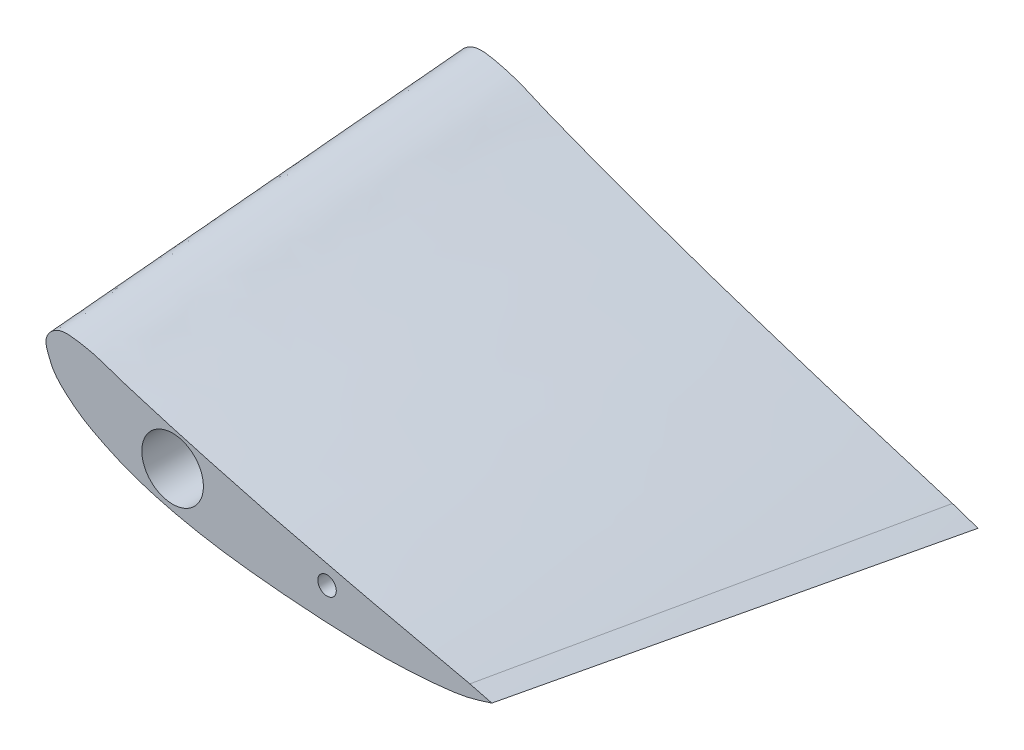
ISO-10303-21;
HEADER;
FILE_DESCRIPTION(('STEP AP214'),'2;1');
FILE_NAME('part.step','',(''),(''),'','','');
FILE_SCHEMA(('AUTOMOTIVE_DESIGN { 1 0 10303 214 1 1 1 1 }'));
ENDSEC;
DATA;
#1=APPLICATION_CONTEXT('core data for automotive mechanical design processes');
#2=APPLICATION_PROTOCOL_DEFINITION('international standard','automotive_design',2000,#1);
#3=PRODUCT_CONTEXT('',#1,'mechanical');
#4=PRODUCT('Part','Part','',(#3));
#5=PRODUCT_RELATED_PRODUCT_CATEGORY('part','',(#4));
#6=PRODUCT_DEFINITION_FORMATION('','',#4);
#7=PRODUCT_DEFINITION_CONTEXT('part definition',#1,'design');
#8=PRODUCT_DEFINITION('design','',#6,#7);
#9=PRODUCT_DEFINITION_SHAPE('','',#8);
#10=(LENGTH_UNIT() NAMED_UNIT(*) SI_UNIT(.MILLI.,.METRE.));
#11=(NAMED_UNIT(*) PLANE_ANGLE_UNIT() SI_UNIT($,.RADIAN.));
#12=(NAMED_UNIT(*) SI_UNIT($,.STERADIAN.) SOLID_ANGLE_UNIT());
#13=UNCERTAINTY_MEASURE_WITH_UNIT(LENGTH_MEASURE(1.E-05),#10,'distance_accuracy_value','');
#14=(GEOMETRIC_REPRESENTATION_CONTEXT(3) GLOBAL_UNCERTAINTY_ASSIGNED_CONTEXT((#13)) GLOBAL_UNIT_ASSIGNED_CONTEXT((#10,
#11,#12)) REPRESENTATION_CONTEXT('',''));
#15=CARTESIAN_POINT('',(0.,0.,0.));
#16=DIRECTION('',(0.,0.,1.));
#17=DIRECTION('',(1.,0.,0.));
#18=AXIS2_PLACEMENT_3D('',#15,#16,#17);
#19=CARTESIAN_POINT('',(-22.8791566427922,7.44781594855477,-70.));
#20=DIRECTION('',(0.,0.,1.));
#21=DIRECTION('',(1.,0.,0.));
#22=AXIS2_PLACEMENT_3D('',#19,#20,#21);
#23=PLANE('',#22);
#24=CARTESIAN_POINT('',(25.0709543311335,-3.88232454138966,-70.));
#25=DIRECTION('',(0.,0.,1.));
#26=DIRECTION('',(1.,0.,0.));
#27=AXIS2_PLACEMENT_3D('',#24,#25,#26);
#28=CIRCLE('',#27,1.5);
#29=CARTESIAN_POINT('',(26.5709543311335,-3.88232454138966,-70.));
#30=VERTEX_POINT('',#29);
#31=EDGE_CURVE('E86',#30,#30,#28,.T.);
#32=ORIENTED_EDGE('',*,*,#31,.T.);
#33=EDGE_LOOP('',(#32));
#34=FACE_BOUND('',#33,.T.);
#35=CARTESIAN_POINT('',(0.,0.,-70.));
#36=DIRECTION('',(0.,0.,1.));
#37=DIRECTION('',(1.,0.,0.));
#38=AXIS2_PLACEMENT_3D('',#35,#36,#37);
#39=CIRCLE('',#38,5.);
#40=CARTESIAN_POINT('',(5.,0.,-70.));
#41=VERTEX_POINT('',#40);
#42=EDGE_CURVE('E66',#41,#41,#39,.T.);
#43=ORIENTED_EDGE('',*,*,#42,.T.);
#44=EDGE_LOOP('',(#43));
#45=FACE_BOUND('',#44,.T.);
#46=CARTESIAN_POINT('',(56.6024570185074,-11.5896250219396,-70.));
#47=CARTESIAN_POINT('',(55.2048134510122,-11.1604344935175,-70.));
#48=CARTESIAN_POINT('',(51.0118827485278,-9.87286290825259,-70.));
#49=CARTESIAN_POINT('',(44.0279175606617,-7.71350006442647,-70.));
#50=CARTESIAN_POINT('',(35.6276858278107,-5.18691611165618,-70.));
#51=CARTESIAN_POINT('',(27.3032106553515,-2.42468744187908,-70.));
#52=CARTESIAN_POINT('',(18.9372859201274,0.206829889001657,-70.));
#53=CARTESIAN_POINT('',(10.6670025413464,3.12378232174524,-70.));
#54=CARTESIAN_POINT('',(2.39098564219053,6.02939924220704,-70.));
#55=CARTESIAN_POINT('',(-4.42699730849515,8.66798481093618,-70.));
#56=CARTESIAN_POINT('',(-9.89533665558932,10.7584765391876,-70.));
#57=CARTESIAN_POINT('',(-13.2101744749283,12.3192783347707,-70.));
#58=CARTESIAN_POINT('',(-16.0130505366379,13.2061990844741,-70.));
#59=CARTESIAN_POINT('',(-18.1637386075881,13.7060850713725,-70.));
#60=CARTESIAN_POINT('',(-20.1343217783409,14.0072685357314,-70.));
#61=CARTESIAN_POINT('',(-22.2016730413183,13.3851171873459,-70.));
#62=CARTESIAN_POINT('',(-24.0774533883304,11.4933873008038,-70.));
#63=CARTESIAN_POINT('',(-23.4002403885398,8.96157065658385,-70.));
#64=CARTESIAN_POINT('',(-22.6715373512482,6.71671597283292,-70.));
#65=CARTESIAN_POINT('',(-21.3153036700787,4.7741931180889,-70.));
#66=CARTESIAN_POINT('',(-19.527035772496,2.97484751217062,-70.));
#67=CARTESIAN_POINT('',(-17.2050988353966,0.864507080193705,-70.));
#68=CARTESIAN_POINT('',(-13.9827172985531,-1.16205904992076,-70.));
#69=CARTESIAN_POINT('',(-8.82190676397202,-4.07801028604748,-70.));
#70=CARTESIAN_POINT('',(-1.95448420856356,-6.75510285468226,-70.));
#71=CARTESIAN_POINT('',(6.50190655456598,-9.19809055034063,-70.));
#72=CARTESIAN_POINT('',(15.1615999891373,-10.9689467410081,-70.));
#73=CARTESIAN_POINT('',(23.9308718776157,-12.4137043340175,-70.));
#74=CARTESIAN_POINT('',(32.8085964211833,-13.5985279541091,-70.));
#75=CARTESIAN_POINT('',(41.8528484347002,-14.4120815557239,-70.));
#76=CARTESIAN_POINT('',(49.5277190812126,-14.461496170333,-70.));
#77=CARTESIAN_POINT('',(55.9026581379685,-14.1804427216733,-70.));
#78=CARTESIAN_POINT('',(59.0999556251021,-13.4036398299236,-70.));
#79=CARTESIAN_POINT('',(60.7529116850797,-13.0020440908682,-70.));
#80=B_SPLINE_CURVE_WITH_KNOTS('',3,(#46,#47,#48,#49,#50,#51,#52,#53,#54,#55,#56,#57,#58,#59,#60,
#61,#62,#63,#64,#65,#66,#67,#68,#69,#70,#71,#72,#73,#74,#75,#76,#77,#78,#79),.UNSPECIFIED.,.F.,
.F.,(4,1,1,1,1,1,1,1,1,1,1,1,1,1,1,1,1,1,1,1,1,1,1,1,1,1,1,1,1,1,1,4),(0.,0.024539223239315,
0.0736176697179449,0.122696116196575,0.171758102468826,0.220820088741077,0.269879113320182,
0.318936693489756,0.368025361597795,0.392583028094628,0.417173001250673,0.429440472758663,
0.441764658743505,0.454461371263475,0.461994015532278,0.477712656864197,0.492780517083889,
0.502278122505289,0.517831839222446,0.531656069899839,0.544957030128068,0.57036121074101,
0.595284183630096,0.644429948946362,0.693535769444944,0.742943262592495,0.792666042354747,
0.842690657547491,0.893260265870848,0.94491578158227,0.971522264346957,1.),.UNSPECIFIED.);
#81=CARTESIAN_POINT('',(56.6024570185074,-11.5896250219396,-70.));
#82=VERTEX_POINT('',#81);
#83=CARTESIAN_POINT('',(60.7529116850797,-13.0020440908682,-70.));
#84=VERTEX_POINT('',#83);
#85=EDGE_CURVE('E63',#82,#84,#80,.T.);
#86=ORIENTED_EDGE('',*,*,#85,.F.);
#87=DIRECTION('',(-0.946684808707422,0.322161253043554,0.));
#88=VECTOR('',#87,1.);
#89=CARTESIAN_POINT('',(56.6024570185074,-11.5896250219396,-70.));
#90=LINE('',#89,#88);
#91=EDGE_CURVE('E37',#84,#82,#90,.T.);
#92=ORIENTED_EDGE('',*,*,#91,.F.);
#93=EDGE_LOOP('',(#86,#92));
#94=FACE_BOUND('',#93,.T.);
#95=ADVANCED_FACE('F34',(#34,#45,#94),#23,.F.);
#96=CARTESIAN_POINT('',(-19.6811363137598,4.79492425979761,0.));
#97=DIRECTION('',(0.,0.,1.));
#98=DIRECTION('',(1.,0.,0.));
#99=AXIS2_PLACEMENT_3D('',#96,#97,#98);
#100=PLANE('',#99);
#101=CARTESIAN_POINT('',(25.0709543311335,-3.88232454138966,0.));
#102=DIRECTION('',(0.,0.,1.));
#103=DIRECTION('',(1.,0.,0.));
#104=AXIS2_PLACEMENT_3D('',#101,#102,#103);
#105=CIRCLE('',#104,1.5);
#106=CARTESIAN_POINT('',(26.5709543311335,-3.88232454138966,0.));
#107=VERTEX_POINT('',#106);
#108=EDGE_CURVE('E89',#107,#107,#105,.T.);
#109=ORIENTED_EDGE('',*,*,#108,.F.);
#110=EDGE_LOOP('',(#109));
#111=FACE_BOUND('',#110,.T.);
#112=CARTESIAN_POINT('',(0.,0.,0.));
#113=DIRECTION('',(0.,0.,1.));
#114=DIRECTION('',(1.,0.,0.));
#115=AXIS2_PLACEMENT_3D('',#112,#113,#114);
#116=CIRCLE('',#115,5.);
#117=CARTESIAN_POINT('',(5.,0.,0.));
#118=VERTEX_POINT('',#117);
#119=EDGE_CURVE('E80',#118,#118,#116,.T.);
#120=ORIENTED_EDGE('',*,*,#119,.F.);
#121=EDGE_LOOP('',(#120));
#122=FACE_BOUND('',#121,.T.);
#123=CARTESIAN_POINT('',(48.2551757332759,-6.12373169062847,0.));
#124=CARTESIAN_POINT('',(47.054535391202,-5.85246277333931,0.));
#125=CARTESIAN_POINT('',(43.4526143649815,-5.03865602147288,0.));
#126=CARTESIAN_POINT('',(37.4521284584218,-3.67078287712665,0.));
#127=CARTESIAN_POINT('',(30.2393159603486,-2.0848495014263,0.));
#128=CARTESIAN_POINT('',(23.0750893565596,-0.296270211024556,0.));
#129=CARTESIAN_POINT('',(15.8843927973687,1.37993852480165,0.));
#130=CARTESIAN_POINT('',(8.75580346600157,3.30185812214174,0.));
#131=CARTESIAN_POINT('',(1.62312300397187,5.21389650059937,0.));
#132=CARTESIAN_POINT('',(-4.26854985932617,6.99464303809463,0.));
#133=CARTESIAN_POINT('',(-8.99230347266472,8.40124550387566,0.));
#134=CARTESIAN_POINT('',(-11.8744834802206,9.50035957220869,0.));
#135=CARTESIAN_POINT('',(-14.2839529373644,10.0663726357262,0.));
#136=CARTESIAN_POINT('',(-16.1212661725206,10.3490202847083,0.));
#137=CARTESIAN_POINT('',(-17.7947266612632,10.4763328510267,0.));
#138=CARTESIAN_POINT('',(-19.4906059492009,9.82235552950465,0.));
#139=CARTESIAN_POINT('',(-20.9447919807827,8.11478913625125,0.));
#140=CARTESIAN_POINT('',(-20.2150047137434,6.03250555271122,0.));
#141=CARTESIAN_POINT('',(-19.4602718509725,4.19440216003422,0.));
#142=CARTESIAN_POINT('',(-18.1979949940236,2.65007560494015,0.));
#143=CARTESIAN_POINT('',(-16.582152295265,1.25346484961709,0.));
#144=CARTESIAN_POINT('',(-14.4984920142379,-0.370226607055651,0.));
#145=CARTESIAN_POINT('',(-11.6642584136947,-1.86623233714782,0.));
#146=CARTESIAN_POINT('',(-7.14608873902189,-3.98538532749056,0.));
#147=CARTESIAN_POINT('',(-1.21045916642468,-5.79530860449215,0.));
#148=CARTESIAN_POINT('',(6.04417290243166,-7.30748683583701,0.));
#149=CARTESIAN_POINT('',(13.4266596421643,-8.24247032524399,0.));
#150=CARTESIAN_POINT('',(20.8803633235686,-8.89671876227693,0.));
#151=CARTESIAN_POINT('',(28.4085535518336,-9.32584807197122,0.));
#152=CARTESIAN_POINT('',(36.0528911415558,-9.43269393728231,0.));
#153=CARTESIAN_POINT('',(42.4989778165968,-8.98528636466733,0.));
#154=CARTESIAN_POINT('',(47.832740527097,-8.34326163812348,0.));
#155=CARTESIAN_POINT('',(50.4673414200419,-7.48747891974686,0.));
#156=CARTESIAN_POINT('',(51.8293915668112,-7.04505176492108,0.));
#157=B_SPLINE_CURVE_WITH_KNOTS('',3,(#123,#124,#125,#126,#127,#128,#129,#130,#131,#132,#133,
#134,#135,#136,#137,#138,#139,#140,#141,#142,#143,#144,#145,#146,#147,#148,#149,#150,#151,#152,
#153,#154,#155,#156),.UNSPECIFIED.,.F.,.F.,(4,1,1,1,1,1,1,1,1,1,1,1,1,1,1,1,1,1,1,1,1,1,1,1,1,1,
1,1,1,1,1,4),(0.,0.024539223239315,0.0736176697179449,0.122696116196575,0.171758102468826,
0.220820088741077,0.269879113320182,0.318936693489756,0.368025361597795,0.392583028094628,
0.417173001250673,0.429440472758663,0.441764658743505,0.454461371263475,0.461994015532278,
0.477712656864197,0.492780517083889,0.502278122505289,0.517831839222446,0.531656069899839,
0.544957030128068,0.57036121074101,0.595284183630096,0.644429948946362,0.693535769444944,
0.742943262592495,0.792666042354747,0.842690657547491,0.893260265870848,0.94491578158227,
0.971522264346957,1.),.UNSPECIFIED.);
#158=CARTESIAN_POINT('',(48.2551757332759,-6.12373169062847,0.));
#159=VERTEX_POINT('',#158);
#160=CARTESIAN_POINT('',(51.8293915668112,-7.04505176492108,0.));
#161=VERTEX_POINT('',#160);
#162=EDGE_CURVE('E43',#159,#161,#157,.T.);
#163=ORIENTED_EDGE('',*,*,#162,.T.);
#164=DIRECTION('',(-0.968346652590715,0.249609215407518,0.));
#165=VECTOR('',#164,1.);
#166=CARTESIAN_POINT('',(48.2551757332759,-6.12373169062847,0.));
#167=LINE('',#166,#165);
#168=EDGE_CURVE('E11',#161,#159,#167,.T.);
#169=ORIENTED_EDGE('',*,*,#168,.T.);
#170=EDGE_LOOP('',(#163,#169));
#171=FACE_BOUND('',#170,.T.);
#172=ADVANCED_FACE('F104',(#111,#122,#171),#100,.T.);
#173=CARTESIAN_POINT('',(51.8293915668112,-7.04505176492108,0.));
#174=CARTESIAN_POINT('',(60.7529116850797,-13.0020440908682,-70.));
#175=CARTESIAN_POINT('',(50.4673414200419,-7.48747891974686,0.));
#176=CARTESIAN_POINT('',(59.0999556251021,-13.4036398299236,-70.));
#177=CARTESIAN_POINT('',(47.832740527097,-8.34326163812348,0.));
#178=CARTESIAN_POINT('',(55.9026581379685,-14.1804427216733,-70.));
#179=CARTESIAN_POINT('',(42.4989778165968,-8.98528636466733,0.));
#180=CARTESIAN_POINT('',(49.5277190812126,-14.461496170333,-70.));
#181=CARTESIAN_POINT('',(36.0528911415558,-9.43269393728231,0.));
#182=CARTESIAN_POINT('',(41.8528484347002,-14.4120815557239,-70.));
#183=CARTESIAN_POINT('',(28.4085535518336,-9.32584807197122,0.));
#184=CARTESIAN_POINT('',(32.8085964211833,-13.5985279541091,-70.));
#185=CARTESIAN_POINT('',(20.8803633235686,-8.89671876227693,0.));
#186=CARTESIAN_POINT('',(23.9308718776157,-12.4137043340175,-70.));
#187=CARTESIAN_POINT('',(13.4266596421643,-8.24247032524399,0.));
#188=CARTESIAN_POINT('',(15.1615999891373,-10.9689467410081,-70.));
#189=CARTESIAN_POINT('',(6.04417290243166,-7.30748683583701,0.));
#190=CARTESIAN_POINT('',(6.50190655456598,-9.19809055034063,-70.));
#191=CARTESIAN_POINT('',(-1.21045916642468,-5.79530860449215,0.));
#192=CARTESIAN_POINT('',(-1.95448420856356,-6.75510285468226,-70.));
#193=CARTESIAN_POINT('',(-7.14608873902189,-3.98538532749056,0.));
#194=CARTESIAN_POINT('',(-8.82190676397202,-4.07801028604748,-70.));
#195=CARTESIAN_POINT('',(-11.6642584136947,-1.86623233714782,0.));
#196=CARTESIAN_POINT('',(-13.9827172985531,-1.16205904992076,-70.));
#197=CARTESIAN_POINT('',(-14.4984920142379,-0.370226607055651,0.));
#198=CARTESIAN_POINT('',(-17.2050988353966,0.864507080193705,-70.));
#199=CARTESIAN_POINT('',(-16.582152295265,1.25346484961709,0.));
#200=CARTESIAN_POINT('',(-19.527035772496,2.97484751217062,-70.));
#201=CARTESIAN_POINT('',(-18.1979949940236,2.65007560494015,0.));
#202=CARTESIAN_POINT('',(-21.3153036700787,4.7741931180889,-70.));
#203=CARTESIAN_POINT('',(-19.4602718509725,4.19440216003422,0.));
#204=CARTESIAN_POINT('',(-22.6715373512482,6.71671597283292,-70.));
#205=CARTESIAN_POINT('',(-20.2150047137434,6.03250555271122,0.));
#206=CARTESIAN_POINT('',(-23.4002403885398,8.96157065658385,-70.));
#207=CARTESIAN_POINT('',(-20.9447919807827,8.11478913625125,0.));
#208=CARTESIAN_POINT('',(-24.0774533883304,11.4933873008038,-70.));
#209=CARTESIAN_POINT('',(-19.4906059492009,9.82235552950465,0.));
#210=CARTESIAN_POINT('',(-22.2016730413183,13.3851171873459,-70.));
#211=CARTESIAN_POINT('',(-17.7947266612632,10.4763328510267,0.));
#212=CARTESIAN_POINT('',(-20.1343217783409,14.0072685357314,-70.));
#213=CARTESIAN_POINT('',(-16.1212661725206,10.3490202847083,0.));
#214=CARTESIAN_POINT('',(-18.1637386075881,13.7060850713725,-70.));
#215=CARTESIAN_POINT('',(-14.2839529373644,10.0663726357262,0.));
#216=CARTESIAN_POINT('',(-16.0130505366379,13.2061990844741,-70.));
#217=CARTESIAN_POINT('',(-11.8744834802206,9.50035957220869,0.));
#218=CARTESIAN_POINT('',(-13.2101744749283,12.3192783347707,-70.));
#219=CARTESIAN_POINT('',(-8.99230347266472,8.40124550387566,0.));
#220=CARTESIAN_POINT('',(-9.89533665558932,10.7584765391876,-70.));
#221=CARTESIAN_POINT('',(-4.26854985932617,6.99464303809463,0.));
#222=CARTESIAN_POINT('',(-4.42699730849515,8.66798481093618,-70.));
#223=CARTESIAN_POINT('',(1.62312300397187,5.21389650059937,0.));
#224=CARTESIAN_POINT('',(2.39098564219053,6.02939924220704,-70.));
#225=CARTESIAN_POINT('',(8.75580346600157,3.30185812214174,0.));
#226=CARTESIAN_POINT('',(10.6670025413464,3.12378232174524,-70.));
#227=CARTESIAN_POINT('',(15.8843927973687,1.37993852480165,0.));
#228=CARTESIAN_POINT('',(18.9372859201274,0.206829889001657,-70.));
#229=CARTESIAN_POINT('',(23.0750893565596,-0.296270211024556,0.));
#230=CARTESIAN_POINT('',(27.3032106553515,-2.42468744187908,-70.));
#231=CARTESIAN_POINT('',(30.2393159603486,-2.0848495014263,0.));
#232=CARTESIAN_POINT('',(35.6276858278107,-5.18691611165618,-70.));
#233=CARTESIAN_POINT('',(37.4521284584218,-3.67078287712665,0.));
#234=CARTESIAN_POINT('',(44.0279175606617,-7.71350006442647,-70.));
#235=CARTESIAN_POINT('',(43.4526143649815,-5.03865602147288,0.));
#236=CARTESIAN_POINT('',(51.0118827485278,-9.87286290825259,-70.));
#237=CARTESIAN_POINT('',(47.054535391202,-5.85246277333931,0.));
#238=CARTESIAN_POINT('',(55.2048134510122,-11.1604344935175,-70.));
#239=CARTESIAN_POINT('',(48.2551757332759,-6.12373169062847,0.));
#240=CARTESIAN_POINT('',(56.6024570185074,-11.5896250219396,-70.));
#241=B_SPLINE_SURFACE_WITH_KNOTS('',3,1,((#173,#174),(#175,#176),(#177,#178),(#179,#180),(#181,
#182),(#183,#184),(#185,#186),(#187,#188),(#189,#190),(#191,#192),(#193,#194),(#195,#196),(#197,
#198),(#199,#200),(#201,#202),(#203,#204),(#205,#206),(#207,#208),(#209,#210),(#211,#212),(#213,
#214),(#215,#216),(#217,#218),(#219,#220),(#221,#222),(#223,#224),(#225,#226),(#227,#228),(#229,
#230),(#231,#232),(#233,#234),(#235,#236),(#237,#238),(#239,#240)),.UNSPECIFIED.,.F.,.F.,.F.,(4,
1,1,1,1,1,1,1,1,1,1,1,1,1,1,1,1,1,1,1,1,1,1,1,1,1,1,1,1,1,1,4),(2,2),(0.,0.0284777356530428,
0.05508421841773,0.106739734129152,0.157309342452509,0.207333957645253,0.257056737407505,
0.306464230555056,0.355570051053638,0.404715816369904,0.42963878925899,0.455042969871932,
0.468343930100161,0.482168160777554,0.497721877494711,0.507219482916111,0.522287343135803,
0.538005984467722,0.545538628736525,0.558235341256495,0.570559527241337,0.582826998749327,
0.607416971905372,0.631974638402205,0.681063306510244,0.730120886679818,0.779179911258923,
0.828241897531174,0.877303883803425,0.926382330282055,0.975460776760685,1.),(0.,1.),.UNSPECIFIED.);
#242=DIRECTION('',(0.11805366002295,-0.0773028595787185,-0.989993737988346));
#243=VECTOR('',#242,1.);
#244=CARTESIAN_POINT('',(52.4288163758916,-8.85667835628405,-35.));
#245=LINE('',#244,#243);
#246=EDGE_CURVE('E58',#159,#82,#245,.T.);
#247=DIRECTION('',(-0.126007315810468,0.0841175459177206,0.988456572051105));
#248=VECTOR('',#247,1.);
#249=CARTESIAN_POINT('',(56.2911516259454,-10.0235479278946,-35.));
#250=LINE('',#249,#248);
#251=EDGE_CURVE('E52',#84,#161,#250,.T.);
#252=ORIENTED_EDGE('',*,*,#162,.F.);
#253=ORIENTED_EDGE('',*,*,#246,.T.);
#254=ORIENTED_EDGE('',*,*,#85,.T.);
#255=ORIENTED_EDGE('',*,*,#251,.T.);
#256=EDGE_LOOP('',(#252,#253,#254,#255));
#257=FACE_BOUND('',#256,.T.);
#258=ADVANCED_FACE('F65',(#257),#241,.T.);
#259=CARTESIAN_POINT('',(48.2551757332759,-6.12373169062847,0.));
#260=CARTESIAN_POINT('',(56.6024570185074,-11.5896250219396,-70.));
#261=CARTESIAN_POINT('',(48.8508783721984,-6.2772850363439,0.));
#262=CARTESIAN_POINT('',(57.2941994629361,-11.8250282000944,-70.));
#263=CARTESIAN_POINT('',(49.4465810111209,-6.43083838205934,0.));
#264=CARTESIAN_POINT('',(57.9859419073648,-12.0604313782492,-70.));
#265=CARTESIAN_POINT('',(50.637986288966,-6.7379450734902,0.));
#266=CARTESIAN_POINT('',(59.3694267962222,-12.5312377345587,-70.));
#267=CARTESIAN_POINT('',(51.2336889278886,-6.89149841920564,0.));
#268=CARTESIAN_POINT('',(60.0611692406509,-12.7666409127134,-70.));
#269=CARTESIAN_POINT('',(51.8293915668112,-7.04505176492108,0.));
#270=CARTESIAN_POINT('',(60.7529116850797,-13.0020440908682,-70.));
#271=B_SPLINE_SURFACE_WITH_KNOTS('',3,1,((#259,#260),(#261,#262),(#263,#264),(#265,#266),(#267,
#268),(#269,#270)),.UNSPECIFIED.,.F.,.F.,.F.,(4,2,4),(2,2),(0.,0.5,1.),(0.,1.),.UNSPECIFIED.);
#272=ORIENTED_EDGE('',*,*,#168,.F.);
#273=ORIENTED_EDGE('',*,*,#251,.F.);
#274=ORIENTED_EDGE('',*,*,#91,.T.);
#275=ORIENTED_EDGE('',*,*,#246,.F.);
#276=EDGE_LOOP('',(#272,#273,#274,#275));
#277=FACE_BOUND('',#276,.T.);
#278=ADVANCED_FACE('F67',(#277),#271,.T.);
#279=CARTESIAN_POINT('',(0.,0.,-70.));
#280=DIRECTION('',(0.,0.,1.));
#281=DIRECTION('',(1.,0.,0.));
#282=AXIS2_PLACEMENT_3D('',#279,#280,#281);
#283=CYLINDRICAL_SURFACE('',#282,5.);
#284=ORIENTED_EDGE('',*,*,#42,.F.);
#285=EDGE_LOOP('',(#284));
#286=FACE_BOUND('',#285,.T.);
#287=ORIENTED_EDGE('',*,*,#119,.T.);
#288=EDGE_LOOP('',(#287));
#289=FACE_BOUND('',#288,.T.);
#290=ADVANCED_FACE('F100',(#286,#289),#283,.F.);
#291=CARTESIAN_POINT('',(25.0709543311335,-3.88232454138966,-70.));
#292=DIRECTION('',(0.,0.,1.));
#293=DIRECTION('',(1.,0.,0.));
#294=AXIS2_PLACEMENT_3D('',#291,#292,#293);
#295=CYLINDRICAL_SURFACE('',#294,1.5);
#296=ORIENTED_EDGE('',*,*,#31,.F.);
#297=EDGE_LOOP('',(#296));
#298=FACE_BOUND('',#297,.T.);
#299=ORIENTED_EDGE('',*,*,#108,.T.);
#300=EDGE_LOOP('',(#299));
#301=FACE_BOUND('',#300,.T.);
#302=ADVANCED_FACE('F97',(#298,#301),#295,.F.);
#303=CLOSED_SHELL('',(#95,#172,#258,#278,#290,#302));
#304=MANIFOLD_SOLID_BREP('B2',#303);
#305=ADVANCED_BREP_SHAPE_REPRESENTATION('',(#18,#304),#14);
#306=SHAPE_DEFINITION_REPRESENTATION(#9,#305);
ENDSEC;
END-ISO-10303-21;
